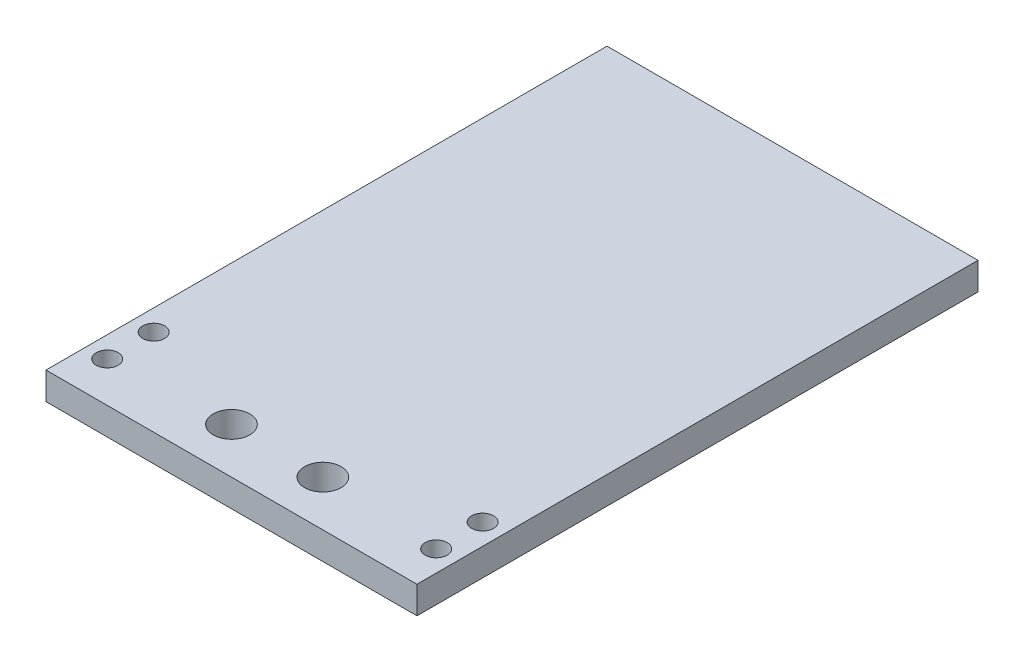
ISO-10303-21;
HEADER;
FILE_DESCRIPTION(('STEP AP214'),'2;1');
FILE_NAME('part.step','',(''),(''),'','','');
FILE_SCHEMA(('AUTOMOTIVE_DESIGN { 1 0 10303 214 1 1 1 1 }'));
ENDSEC;
DATA;
#1=APPLICATION_CONTEXT('core data for automotive mechanical design processes');
#2=APPLICATION_PROTOCOL_DEFINITION('international standard','automotive_design',2000,#1);
#3=PRODUCT_CONTEXT('',#1,'mechanical');
#4=PRODUCT('Part','Part','',(#3));
#5=PRODUCT_RELATED_PRODUCT_CATEGORY('part','',(#4));
#6=PRODUCT_DEFINITION_FORMATION('','',#4);
#7=PRODUCT_DEFINITION_CONTEXT('part definition',#1,'design');
#8=PRODUCT_DEFINITION('design','',#6,#7);
#9=PRODUCT_DEFINITION_SHAPE('','',#8);
#10=(LENGTH_UNIT() NAMED_UNIT(*) SI_UNIT(.MILLI.,.METRE.));
#11=(NAMED_UNIT(*) PLANE_ANGLE_UNIT() SI_UNIT($,.RADIAN.));
#12=(NAMED_UNIT(*) SI_UNIT($,.STERADIAN.) SOLID_ANGLE_UNIT());
#13=UNCERTAINTY_MEASURE_WITH_UNIT(LENGTH_MEASURE(1.E-05),#10,'distance_accuracy_value','');
#14=(GEOMETRIC_REPRESENTATION_CONTEXT(3) GLOBAL_UNCERTAINTY_ASSIGNED_CONTEXT((#13)) GLOBAL_UNIT_ASSIGNED_CONTEXT((#10,
#11,#12)) REPRESENTATION_CONTEXT('',''));
#15=CARTESIAN_POINT('',(0.,0.,0.));
#16=DIRECTION('',(0.,0.,1.));
#17=DIRECTION('',(1.,0.,0.));
#18=AXIS2_PLACEMENT_3D('',#15,#16,#17);
#19=CARTESIAN_POINT('',(0.,1.5,0.));
#20=DIRECTION('',(0.,-1.,0.));
#21=DIRECTION('',(0.,0.,-1.));
#22=AXIS2_PLACEMENT_3D('',#19,#20,#21);
#23=PLANE('',#22);
#24=DIRECTION('',(0.,0.,1.));
#25=VECTOR('',#24,1.);
#26=CARTESIAN_POINT('',(-10.15,1.5,-15.35));
#27=LINE('',#26,#25);
#28=CARTESIAN_POINT('',(-10.15,1.5,-15.35));
#29=VERTEX_POINT('',#28);
#30=CARTESIAN_POINT('',(-10.15,1.5,15.35));
#31=VERTEX_POINT('',#30);
#32=EDGE_CURVE('E95',#29,#31,#27,.T.);
#33=ORIENTED_EDGE('',*,*,#32,.T.);
#34=DIRECTION('',(1.,0.,0.));
#35=VECTOR('',#34,1.);
#36=CARTESIAN_POINT('',(10.15,1.5,15.35));
#37=LINE('',#36,#35);
#38=CARTESIAN_POINT('',(10.15,1.5,15.35));
#39=VERTEX_POINT('',#38);
#40=EDGE_CURVE('E90',#31,#39,#37,.T.);
#41=ORIENTED_EDGE('',*,*,#40,.T.);
#42=DIRECTION('',(0.,0.,-1.));
#43=VECTOR('',#42,1.);
#44=CARTESIAN_POINT('',(10.15,1.5,-15.35));
#45=LINE('',#44,#43);
#46=CARTESIAN_POINT('',(10.15,1.5,-15.35));
#47=VERTEX_POINT('',#46);
#48=EDGE_CURVE('E93',#39,#47,#45,.T.);
#49=ORIENTED_EDGE('',*,*,#48,.T.);
#50=DIRECTION('',(-1.,0.,0.));
#51=VECTOR('',#50,1.);
#52=CARTESIAN_POINT('',(10.15,1.5,-15.35));
#53=LINE('',#52,#51);
#54=EDGE_CURVE('E60',#47,#29,#53,.T.);
#55=ORIENTED_EDGE('',*,*,#54,.T.);
#56=EDGE_LOOP('',(#33,#41,#49,#55));
#57=FACE_BOUND('',#56,.T.);
#58=CARTESIAN_POINT('',(-9.,1.5,13.15));
#59=DIRECTION('',(0.,1.,0.));
#60=DIRECTION('',(0.,0.,1.));
#61=AXIS2_PLACEMENT_3D('',#58,#59,#60);
#62=CIRCLE('',#61,0.6);
#63=CARTESIAN_POINT('',(-9.,1.5,13.75));
#64=VERTEX_POINT('',#63);
#65=EDGE_CURVE('E113',#64,#64,#62,.T.);
#66=ORIENTED_EDGE('',*,*,#65,.F.);
#67=EDGE_LOOP('',(#66));
#68=FACE_BOUND('',#67,.T.);
#69=CARTESIAN_POINT('',(-9.,1.5,10.61));
#70=DIRECTION('',(0.,1.,0.));
#71=DIRECTION('',(0.,0.,1.));
#72=AXIS2_PLACEMENT_3D('',#69,#70,#71);
#73=CIRCLE('',#72,0.6);
#74=CARTESIAN_POINT('',(-9.,1.5,11.21));
#75=VERTEX_POINT('',#74);
#76=EDGE_CURVE('E132',#75,#75,#73,.T.);
#77=ORIENTED_EDGE('',*,*,#76,.F.);
#78=EDGE_LOOP('',(#77));
#79=FACE_BOUND('',#78,.T.);
#80=CARTESIAN_POINT('',(9.,1.5,13.15));
#81=DIRECTION('',(0.,1.,0.));
#82=DIRECTION('',(0.,0.,-1.));
#83=AXIS2_PLACEMENT_3D('',#80,#81,#82);
#84=CIRCLE('',#83,0.6);
#85=CARTESIAN_POINT('',(9.,1.5,12.55));
#86=VERTEX_POINT('',#85);
#87=EDGE_CURVE('E139',#86,#86,#84,.T.);
#88=ORIENTED_EDGE('',*,*,#87,.F.);
#89=EDGE_LOOP('',(#88));
#90=FACE_BOUND('',#89,.T.);
#91=CARTESIAN_POINT('',(9.,1.5,10.61));
#92=DIRECTION('',(0.,1.,0.));
#93=DIRECTION('',(0.,0.,-1.));
#94=AXIS2_PLACEMENT_3D('',#91,#92,#93);
#95=CIRCLE('',#94,0.6);
#96=CARTESIAN_POINT('',(9.,1.5,10.01));
#97=VERTEX_POINT('',#96);
#98=EDGE_CURVE('E146',#97,#97,#95,.T.);
#99=ORIENTED_EDGE('',*,*,#98,.F.);
#100=EDGE_LOOP('',(#99));
#101=FACE_BOUND('',#100,.T.);
#102=CARTESIAN_POINT('',(-2.5,1.5,12.85));
#103=DIRECTION('',(0.,1.,0.));
#104=DIRECTION('',(0.,0.,1.));
#105=AXIS2_PLACEMENT_3D('',#102,#103,#104);
#106=CIRCLE('',#105,1.);
#107=CARTESIAN_POINT('',(-2.5,1.5,13.85));
#108=VERTEX_POINT('',#107);
#109=EDGE_CURVE('E152',#108,#108,#106,.T.);
#110=ORIENTED_EDGE('',*,*,#109,.F.);
#111=EDGE_LOOP('',(#110));
#112=FACE_BOUND('',#111,.T.);
#113=CARTESIAN_POINT('',(2.5,1.5,12.85));
#114=DIRECTION('',(0.,1.,0.));
#115=DIRECTION('',(0.,0.,-1.));
#116=AXIS2_PLACEMENT_3D('',#113,#114,#115);
#117=CIRCLE('',#116,1.);
#118=CARTESIAN_POINT('',(2.5,1.5,11.85));
#119=VERTEX_POINT('',#118);
#120=EDGE_CURVE('E159',#119,#119,#117,.T.);
#121=ORIENTED_EDGE('',*,*,#120,.F.);
#122=EDGE_LOOP('',(#121));
#123=FACE_BOUND('',#122,.T.);
#124=ADVANCED_FACE('F41',(#57,#68,#79,#90,#101,#112,#123),#23,.F.);
#125=CARTESIAN_POINT('',(0.,0.,0.));
#126=DIRECTION('',(0.,-1.,0.));
#127=DIRECTION('',(0.,0.,-1.));
#128=AXIS2_PLACEMENT_3D('',#125,#126,#127);
#129=PLANE('',#128);
#130=CARTESIAN_POINT('',(-2.5,0.,12.85));
#131=DIRECTION('',(0.,1.,0.));
#132=DIRECTION('',(0.,0.,1.));
#133=AXIS2_PLACEMENT_3D('',#130,#131,#132);
#134=CIRCLE('',#133,1.);
#135=CARTESIAN_POINT('',(-2.5,0.,13.85));
#136=VERTEX_POINT('',#135);
#137=EDGE_CURVE('E155',#136,#136,#134,.T.);
#138=ORIENTED_EDGE('',*,*,#137,.T.);
#139=EDGE_LOOP('',(#138));
#140=FACE_BOUND('',#139,.T.);
#141=CARTESIAN_POINT('',(9.,0.,13.15));
#142=DIRECTION('',(0.,1.,0.));
#143=DIRECTION('',(0.,0.,-1.));
#144=AXIS2_PLACEMENT_3D('',#141,#142,#143);
#145=CIRCLE('',#144,0.6);
#146=CARTESIAN_POINT('',(9.,0.,12.55));
#147=VERTEX_POINT('',#146);
#148=EDGE_CURVE('E143',#147,#147,#145,.T.);
#149=ORIENTED_EDGE('',*,*,#148,.T.);
#150=EDGE_LOOP('',(#149));
#151=FACE_BOUND('',#150,.T.);
#152=CARTESIAN_POINT('',(-9.,0.,13.15));
#153=DIRECTION('',(0.,1.,0.));
#154=DIRECTION('',(0.,0.,1.));
#155=AXIS2_PLACEMENT_3D('',#152,#153,#154);
#156=CIRCLE('',#155,0.6);
#157=CARTESIAN_POINT('',(-9.,0.,13.75));
#158=VERTEX_POINT('',#157);
#159=EDGE_CURVE('E129',#158,#158,#156,.T.);
#160=ORIENTED_EDGE('',*,*,#159,.T.);
#161=EDGE_LOOP('',(#160));
#162=FACE_BOUND('',#161,.T.);
#163=DIRECTION('',(0.,0.,1.));
#164=VECTOR('',#163,1.);
#165=CARTESIAN_POINT('',(-10.15,0.,-15.35));
#166=LINE('',#165,#164);
#167=CARTESIAN_POINT('',(-10.15,0.,-15.35));
#168=VERTEX_POINT('',#167);
#169=CARTESIAN_POINT('',(-10.15,0.,15.35));
#170=VERTEX_POINT('',#169);
#171=EDGE_CURVE('E109',#168,#170,#166,.T.);
#172=ORIENTED_EDGE('',*,*,#171,.F.);
#173=DIRECTION('',(-1.,0.,0.));
#174=VECTOR('',#173,1.);
#175=CARTESIAN_POINT('',(10.15,0.,-15.35));
#176=LINE('',#175,#174);
#177=CARTESIAN_POINT('',(10.15,0.,-15.35));
#178=VERTEX_POINT('',#177);
#179=EDGE_CURVE('E83',#178,#168,#176,.T.);
#180=ORIENTED_EDGE('',*,*,#179,.F.);
#181=DIRECTION('',(0.,0.,-1.));
#182=VECTOR('',#181,1.);
#183=CARTESIAN_POINT('',(10.15,0.,-15.35));
#184=LINE('',#183,#182);
#185=CARTESIAN_POINT('',(10.15,0.,15.35));
#186=VERTEX_POINT('',#185);
#187=EDGE_CURVE('E77',#186,#178,#184,.T.);
#188=ORIENTED_EDGE('',*,*,#187,.F.);
#189=DIRECTION('',(1.,0.,0.));
#190=VECTOR('',#189,1.);
#191=CARTESIAN_POINT('',(10.15,0.,15.35));
#192=LINE('',#191,#190);
#193=EDGE_CURVE('E100',#170,#186,#192,.T.);
#194=ORIENTED_EDGE('',*,*,#193,.F.);
#195=EDGE_LOOP('',(#172,#180,#188,#194));
#196=FACE_BOUND('',#195,.T.);
#197=CARTESIAN_POINT('',(-9.,0.,10.61));
#198=DIRECTION('',(0.,1.,0.));
#199=DIRECTION('',(0.,0.,1.));
#200=AXIS2_PLACEMENT_3D('',#197,#198,#199);
#201=CIRCLE('',#200,0.6);
#202=CARTESIAN_POINT('',(-9.,0.,11.21));
#203=VERTEX_POINT('',#202);
#204=EDGE_CURVE('E136',#203,#203,#201,.T.);
#205=ORIENTED_EDGE('',*,*,#204,.T.);
#206=EDGE_LOOP('',(#205));
#207=FACE_BOUND('',#206,.T.);
#208=CARTESIAN_POINT('',(9.,0.,10.61));
#209=DIRECTION('',(0.,1.,0.));
#210=DIRECTION('',(0.,0.,-1.));
#211=AXIS2_PLACEMENT_3D('',#208,#209,#210);
#212=CIRCLE('',#211,0.6);
#213=CARTESIAN_POINT('',(9.,0.,10.01));
#214=VERTEX_POINT('',#213);
#215=EDGE_CURVE('E149',#214,#214,#212,.T.);
#216=ORIENTED_EDGE('',*,*,#215,.T.);
#217=EDGE_LOOP('',(#216));
#218=FACE_BOUND('',#217,.T.);
#219=CARTESIAN_POINT('',(2.5,0.,12.85));
#220=DIRECTION('',(0.,1.,0.));
#221=DIRECTION('',(0.,0.,-1.));
#222=AXIS2_PLACEMENT_3D('',#219,#220,#221);
#223=CIRCLE('',#222,1.);
#224=CARTESIAN_POINT('',(2.5,0.,11.85));
#225=VERTEX_POINT('',#224);
#226=EDGE_CURVE('E163',#225,#225,#223,.T.);
#227=ORIENTED_EDGE('',*,*,#226,.T.);
#228=EDGE_LOOP('',(#227));
#229=FACE_BOUND('',#228,.T.);
#230=ADVANCED_FACE('F124',(#140,#151,#162,#196,#207,#218,#229),#129,.T.);
#231=CARTESIAN_POINT('',(-10.15,1.5,-15.35));
#232=DIRECTION('',(1.,0.,0.));
#233=DIRECTION('',(0.,0.,-1.));
#234=AXIS2_PLACEMENT_3D('',#231,#232,#233);
#235=PLANE('',#234);
#236=ORIENTED_EDGE('',*,*,#171,.T.);
#237=DIRECTION('',(0.,-1.,0.));
#238=VECTOR('',#237,1.);
#239=CARTESIAN_POINT('',(-10.15,1.5,15.35));
#240=LINE('',#239,#238);
#241=EDGE_CURVE('E11',#31,#170,#240,.T.);
#242=ORIENTED_EDGE('',*,*,#241,.F.);
#243=ORIENTED_EDGE('',*,*,#32,.F.);
#244=DIRECTION('',(0.,-1.,0.));
#245=VECTOR('',#244,1.);
#246=CARTESIAN_POINT('',(-10.15,1.5,-15.35));
#247=LINE('',#246,#245);
#248=EDGE_CURVE('E105',#29,#168,#247,.T.);
#249=ORIENTED_EDGE('',*,*,#248,.T.);
#250=EDGE_LOOP('',(#236,#242,#243,#249));
#251=FACE_BOUND('',#250,.T.);
#252=ADVANCED_FACE('F43',(#251),#235,.F.);
#253=CARTESIAN_POINT('',(10.15,1.5,15.35));
#254=DIRECTION('',(0.,0.,-1.));
#255=DIRECTION('',(-1.,0.,0.));
#256=AXIS2_PLACEMENT_3D('',#253,#254,#255);
#257=PLANE('',#256);
#258=ORIENTED_EDGE('',*,*,#193,.T.);
#259=DIRECTION('',(0.,-1.,0.));
#260=VECTOR('',#259,1.);
#261=CARTESIAN_POINT('',(10.15,1.5,15.35));
#262=LINE('',#261,#260);
#263=EDGE_CURVE('E50',#39,#186,#262,.T.);
#264=ORIENTED_EDGE('',*,*,#263,.F.);
#265=ORIENTED_EDGE('',*,*,#40,.F.);
#266=ORIENTED_EDGE('',*,*,#241,.T.);
#267=EDGE_LOOP('',(#258,#264,#265,#266));
#268=FACE_BOUND('',#267,.T.);
#269=ADVANCED_FACE('F99',(#268),#257,.F.);
#270=CARTESIAN_POINT('',(10.15,1.5,-15.35));
#271=DIRECTION('',(-1.,0.,0.));
#272=DIRECTION('',(0.,0.,1.));
#273=AXIS2_PLACEMENT_3D('',#270,#271,#272);
#274=PLANE('',#273);
#275=ORIENTED_EDGE('',*,*,#187,.T.);
#276=DIRECTION('',(0.,-1.,0.));
#277=VECTOR('',#276,1.);
#278=CARTESIAN_POINT('',(10.15,1.5,-15.35));
#279=LINE('',#278,#277);
#280=EDGE_CURVE('E101',#47,#178,#279,.T.);
#281=ORIENTED_EDGE('',*,*,#280,.F.);
#282=ORIENTED_EDGE('',*,*,#48,.F.);
#283=ORIENTED_EDGE('',*,*,#263,.T.);
#284=EDGE_LOOP('',(#275,#281,#282,#283));
#285=FACE_BOUND('',#284,.T.);
#286=ADVANCED_FACE('F102',(#285),#274,.F.);
#287=CARTESIAN_POINT('',(10.15,1.5,-15.35));
#288=DIRECTION('',(0.,0.,1.));
#289=DIRECTION('',(1.,0.,0.));
#290=AXIS2_PLACEMENT_3D('',#287,#288,#289);
#291=PLANE('',#290);
#292=ORIENTED_EDGE('',*,*,#179,.T.);
#293=ORIENTED_EDGE('',*,*,#248,.F.);
#294=ORIENTED_EDGE('',*,*,#54,.F.);
#295=ORIENTED_EDGE('',*,*,#280,.T.);
#296=EDGE_LOOP('',(#292,#293,#294,#295));
#297=FACE_BOUND('',#296,.T.);
#298=ADVANCED_FACE('F121',(#297),#291,.F.);
#299=CARTESIAN_POINT('',(-9.,1.5,13.15));
#300=DIRECTION('',(0.,-1.,0.));
#301=DIRECTION('',(0.,0.,-1.));
#302=AXIS2_PLACEMENT_3D('',#299,#300,#301);
#303=CYLINDRICAL_SURFACE('',#302,0.6);
#304=ORIENTED_EDGE('',*,*,#65,.T.);
#305=EDGE_LOOP('',(#304));
#306=FACE_BOUND('',#305,.T.);
#307=ORIENTED_EDGE('',*,*,#159,.F.);
#308=EDGE_LOOP('',(#307));
#309=FACE_BOUND('',#308,.T.);
#310=ADVANCED_FACE('F182',(#306,#309),#303,.F.);
#311=CARTESIAN_POINT('',(-9.,1.5,10.61));
#312=DIRECTION('',(0.,-1.,0.));
#313=DIRECTION('',(0.,0.,-1.));
#314=AXIS2_PLACEMENT_3D('',#311,#312,#313);
#315=CYLINDRICAL_SURFACE('',#314,0.6);
#316=ORIENTED_EDGE('',*,*,#76,.T.);
#317=EDGE_LOOP('',(#316));
#318=FACE_BOUND('',#317,.T.);
#319=ORIENTED_EDGE('',*,*,#204,.F.);
#320=EDGE_LOOP('',(#319));
#321=FACE_BOUND('',#320,.T.);
#322=ADVANCED_FACE('F212',(#318,#321),#315,.F.);
#323=CARTESIAN_POINT('',(9.,1.5,13.15));
#324=DIRECTION('',(0.,-1.,0.));
#325=DIRECTION('',(0.,0.,-1.));
#326=AXIS2_PLACEMENT_3D('',#323,#324,#325);
#327=CYLINDRICAL_SURFACE('',#326,0.6);
#328=ORIENTED_EDGE('',*,*,#87,.T.);
#329=EDGE_LOOP('',(#328));
#330=FACE_BOUND('',#329,.T.);
#331=ORIENTED_EDGE('',*,*,#148,.F.);
#332=EDGE_LOOP('',(#331));
#333=FACE_BOUND('',#332,.T.);
#334=ADVANCED_FACE('F219',(#330,#333),#327,.F.);
#335=CARTESIAN_POINT('',(9.,1.5,10.61));
#336=DIRECTION('',(0.,-1.,0.));
#337=DIRECTION('',(0.,0.,-1.));
#338=AXIS2_PLACEMENT_3D('',#335,#336,#337);
#339=CYLINDRICAL_SURFACE('',#338,0.6);
#340=ORIENTED_EDGE('',*,*,#98,.T.);
#341=EDGE_LOOP('',(#340));
#342=FACE_BOUND('',#341,.T.);
#343=ORIENTED_EDGE('',*,*,#215,.F.);
#344=EDGE_LOOP('',(#343));
#345=FACE_BOUND('',#344,.T.);
#346=ADVANCED_FACE('F226',(#342,#345),#339,.F.);
#347=CARTESIAN_POINT('',(-2.5,1.5,12.85));
#348=DIRECTION('',(0.,-1.,0.));
#349=DIRECTION('',(0.,0.,-1.));
#350=AXIS2_PLACEMENT_3D('',#347,#348,#349);
#351=CYLINDRICAL_SURFACE('',#350,1.);
#352=ORIENTED_EDGE('',*,*,#109,.T.);
#353=EDGE_LOOP('',(#352));
#354=FACE_BOUND('',#353,.T.);
#355=ORIENTED_EDGE('',*,*,#137,.F.);
#356=EDGE_LOOP('',(#355));
#357=FACE_BOUND('',#356,.T.);
#358=ADVANCED_FACE('F234',(#354,#357),#351,.F.);
#359=CARTESIAN_POINT('',(2.5,1.5,12.85));
#360=DIRECTION('',(0.,-1.,0.));
#361=DIRECTION('',(0.,0.,-1.));
#362=AXIS2_PLACEMENT_3D('',#359,#360,#361);
#363=CYLINDRICAL_SURFACE('',#362,1.);
#364=ORIENTED_EDGE('',*,*,#120,.T.);
#365=EDGE_LOOP('',(#364));
#366=FACE_BOUND('',#365,.T.);
#367=ORIENTED_EDGE('',*,*,#226,.F.);
#368=EDGE_LOOP('',(#367));
#369=FACE_BOUND('',#368,.T.);
#370=ADVANCED_FACE('F171',(#366,#369),#363,.F.);
#371=CLOSED_SHELL('',(#124,#230,#252,#269,#286,#298,#310,#322,#334,#346,#358,#370));
#372=MANIFOLD_SOLID_BREP('B2',#371);
#373=ADVANCED_BREP_SHAPE_REPRESENTATION('',(#18,#372),#14);
#374=SHAPE_DEFINITION_REPRESENTATION(#9,#373);
ENDSEC;
END-ISO-10303-21;
